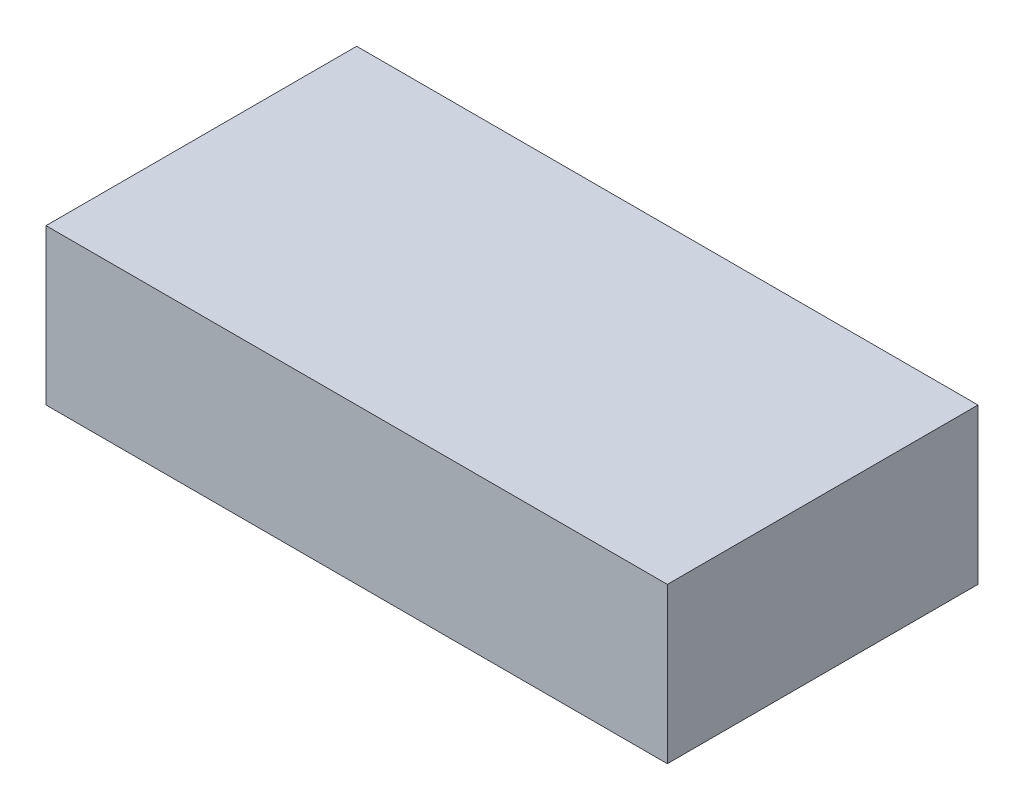
ISO-10303-21;
HEADER;
FILE_DESCRIPTION(('STEP AP214'),'2;1');
FILE_NAME('part.step','',(''),(''),'','','');
FILE_SCHEMA(('AUTOMOTIVE_DESIGN { 1 0 10303 214 1 1 1 1 }'));
ENDSEC;
DATA;
#1=APPLICATION_CONTEXT('core data for automotive mechanical design processes');
#2=APPLICATION_PROTOCOL_DEFINITION('international standard','automotive_design',2000,#1);
#3=PRODUCT_CONTEXT('',#1,'mechanical');
#4=PRODUCT('Part','Part','',(#3));
#5=PRODUCT_RELATED_PRODUCT_CATEGORY('part','',(#4));
#6=PRODUCT_DEFINITION_FORMATION('','',#4);
#7=PRODUCT_DEFINITION_CONTEXT('part definition',#1,'design');
#8=PRODUCT_DEFINITION('design','',#6,#7);
#9=PRODUCT_DEFINITION_SHAPE('','',#8);
#10=(LENGTH_UNIT() NAMED_UNIT(*) SI_UNIT(.MILLI.,.METRE.));
#11=(NAMED_UNIT(*) PLANE_ANGLE_UNIT() SI_UNIT($,.RADIAN.));
#12=(NAMED_UNIT(*) SI_UNIT($,.STERADIAN.) SOLID_ANGLE_UNIT());
#13=UNCERTAINTY_MEASURE_WITH_UNIT(LENGTH_MEASURE(1.E-05),#10,'distance_accuracy_value','');
#14=(GEOMETRIC_REPRESENTATION_CONTEXT(3) GLOBAL_UNCERTAINTY_ASSIGNED_CONTEXT((#13)) GLOBAL_UNIT_ASSIGNED_CONTEXT((#10,
#11,#12)) REPRESENTATION_CONTEXT('',''));
#15=CARTESIAN_POINT('',(0.,0.,0.));
#16=DIRECTION('',(0.,0.,1.));
#17=DIRECTION('',(1.,0.,0.));
#18=AXIS2_PLACEMENT_3D('',#15,#16,#17);
#19=CARTESIAN_POINT('',(0.,-10.,0.));
#20=DIRECTION('',(-1.,0.,0.));
#21=DIRECTION('',(0.,0.,1.));
#22=AXIS2_PLACEMENT_3D('',#19,#20,#21);
#23=PLANE('',#22);
#24=DIRECTION('',(0.,0.,1.));
#25=VECTOR('',#24,1.);
#26=CARTESIAN_POINT('',(0.,0.,0.));
#27=LINE('',#26,#25);
#28=CARTESIAN_POINT('',(0.,0.,-20.));
#29=VERTEX_POINT('',#28);
#30=CARTESIAN_POINT('',(0.,0.,0.));
#31=VERTEX_POINT('',#30);
#32=EDGE_CURVE('E104',#29,#31,#27,.T.);
#33=ORIENTED_EDGE('',*,*,#32,.F.);
#34=DIRECTION('',(0.,1.,0.));
#35=VECTOR('',#34,1.);
#36=CARTESIAN_POINT('',(0.,-10.,-20.));
#37=LINE('',#36,#35);
#38=CARTESIAN_POINT('',(0.,-10.,-20.));
#39=VERTEX_POINT('',#38);
#40=EDGE_CURVE('E11',#39,#29,#37,.T.);
#41=ORIENTED_EDGE('',*,*,#40,.F.);
#42=DIRECTION('',(0.,0.,1.));
#43=VECTOR('',#42,1.);
#44=CARTESIAN_POINT('',(0.,-10.,0.));
#45=LINE('',#44,#43);
#46=CARTESIAN_POINT('',(0.,-10.,0.));
#47=VERTEX_POINT('',#46);
#48=EDGE_CURVE('E100',#39,#47,#45,.T.);
#49=ORIENTED_EDGE('',*,*,#48,.T.);
#50=DIRECTION('',(0.,1.,0.));
#51=VECTOR('',#50,1.);
#52=CARTESIAN_POINT('',(0.,-10.,0.));
#53=LINE('',#52,#51);
#54=EDGE_CURVE('E45',#47,#31,#53,.T.);
#55=ORIENTED_EDGE('',*,*,#54,.T.);
#56=EDGE_LOOP('',(#33,#41,#49,#55));
#57=FACE_BOUND('',#56,.T.);
#58=ADVANCED_FACE('F39',(#57),#23,.T.);
#59=CARTESIAN_POINT('',(0.,-10.,-20.));
#60=DIRECTION('',(0.,0.,-1.));
#61=DIRECTION('',(-1.,0.,0.));
#62=AXIS2_PLACEMENT_3D('',#59,#60,#61);
#63=PLANE('',#62);
#64=DIRECTION('',(-1.,0.,0.));
#65=VECTOR('',#64,1.);
#66=CARTESIAN_POINT('',(0.,0.,-20.));
#67=LINE('',#66,#65);
#68=CARTESIAN_POINT('',(40.,0.,-20.));
#69=VERTEX_POINT('',#68);
#70=EDGE_CURVE('E98',#69,#29,#67,.T.);
#71=ORIENTED_EDGE('',*,*,#70,.F.);
#72=DIRECTION('',(0.,1.,0.));
#73=VECTOR('',#72,1.);
#74=CARTESIAN_POINT('',(40.,-10.,-20.));
#75=LINE('',#74,#73);
#76=CARTESIAN_POINT('',(40.,-10.,-20.));
#77=VERTEX_POINT('',#76);
#78=EDGE_CURVE('E48',#77,#69,#75,.T.);
#79=ORIENTED_EDGE('',*,*,#78,.F.);
#80=DIRECTION('',(-1.,0.,0.));
#81=VECTOR('',#80,1.);
#82=CARTESIAN_POINT('',(0.,-10.,-20.));
#83=LINE('',#82,#81);
#84=EDGE_CURVE('E92',#77,#39,#83,.T.);
#85=ORIENTED_EDGE('',*,*,#84,.T.);
#86=ORIENTED_EDGE('',*,*,#40,.T.);
#87=EDGE_LOOP('',(#71,#79,#85,#86));
#88=FACE_BOUND('',#87,.T.);
#89=ADVANCED_FACE('F111',(#88),#63,.T.);
#90=CARTESIAN_POINT('',(40.,-10.,0.));
#91=DIRECTION('',(1.,0.,0.));
#92=DIRECTION('',(0.,0.,-1.));
#93=AXIS2_PLACEMENT_3D('',#90,#91,#92);
#94=PLANE('',#93);
#95=DIRECTION('',(0.,0.,-1.));
#96=VECTOR('',#95,1.);
#97=CARTESIAN_POINT('',(40.,0.,0.));
#98=LINE('',#97,#96);
#99=CARTESIAN_POINT('',(40.,0.,0.));
#100=VERTEX_POINT('',#99);
#101=EDGE_CURVE('E87',#100,#69,#98,.T.);
#102=ORIENTED_EDGE('',*,*,#101,.F.);
#103=DIRECTION('',(0.,1.,0.));
#104=VECTOR('',#103,1.);
#105=CARTESIAN_POINT('',(40.,-10.,0.));
#106=LINE('',#105,#104);
#107=CARTESIAN_POINT('',(40.,-10.,0.));
#108=VERTEX_POINT('',#107);
#109=EDGE_CURVE('E84',#108,#100,#106,.T.);
#110=ORIENTED_EDGE('',*,*,#109,.F.);
#111=DIRECTION('',(0.,0.,-1.));
#112=VECTOR('',#111,1.);
#113=CARTESIAN_POINT('',(40.,-10.,0.));
#114=LINE('',#113,#112);
#115=EDGE_CURVE('E90',#108,#77,#114,.T.);
#116=ORIENTED_EDGE('',*,*,#115,.T.);
#117=ORIENTED_EDGE('',*,*,#78,.T.);
#118=EDGE_LOOP('',(#102,#110,#116,#117));
#119=FACE_BOUND('',#118,.T.);
#120=ADVANCED_FACE('F86',(#119),#94,.T.);
#121=CARTESIAN_POINT('',(0.,-10.,0.));
#122=DIRECTION('',(0.,0.,1.));
#123=DIRECTION('',(1.,0.,0.));
#124=AXIS2_PLACEMENT_3D('',#121,#122,#123);
#125=PLANE('',#124);
#126=DIRECTION('',(1.,0.,0.));
#127=VECTOR('',#126,1.);
#128=CARTESIAN_POINT('',(0.,0.,0.));
#129=LINE('',#128,#127);
#130=EDGE_CURVE('E106',#31,#100,#129,.T.);
#131=ORIENTED_EDGE('',*,*,#130,.F.);
#132=ORIENTED_EDGE('',*,*,#54,.F.);
#133=DIRECTION('',(1.,0.,0.));
#134=VECTOR('',#133,1.);
#135=CARTESIAN_POINT('',(0.,-10.,0.));
#136=LINE('',#135,#134);
#137=EDGE_CURVE('E93',#47,#108,#136,.T.);
#138=ORIENTED_EDGE('',*,*,#137,.T.);
#139=ORIENTED_EDGE('',*,*,#109,.T.);
#140=EDGE_LOOP('',(#131,#132,#138,#139));
#141=FACE_BOUND('',#140,.T.);
#142=ADVANCED_FACE('F96',(#141),#125,.T.);
#143=CARTESIAN_POINT('',(0.,-10.,0.));
#144=DIRECTION('',(0.,-1.,0.));
#145=DIRECTION('',(0.,0.,-1.));
#146=AXIS2_PLACEMENT_3D('',#143,#144,#145);
#147=PLANE('',#146);
#148=ORIENTED_EDGE('',*,*,#48,.F.);
#149=ORIENTED_EDGE('',*,*,#84,.F.);
#150=ORIENTED_EDGE('',*,*,#115,.F.);
#151=ORIENTED_EDGE('',*,*,#137,.F.);
#152=EDGE_LOOP('',(#148,#149,#150,#151));
#153=FACE_BOUND('',#152,.T.);
#154=ADVANCED_FACE('F95',(#153),#147,.T.);
#155=CARTESIAN_POINT('',(0.,0.,0.));
#156=DIRECTION('',(0.,-1.,0.));
#157=DIRECTION('',(0.,0.,-1.));
#158=AXIS2_PLACEMENT_3D('',#155,#156,#157);
#159=PLANE('',#158);
#160=ORIENTED_EDGE('',*,*,#32,.T.);
#161=ORIENTED_EDGE('',*,*,#130,.T.);
#162=ORIENTED_EDGE('',*,*,#101,.T.);
#163=ORIENTED_EDGE('',*,*,#70,.T.);
#164=EDGE_LOOP('',(#160,#161,#162,#163));
#165=FACE_BOUND('',#164,.T.);
#166=ADVANCED_FACE('F115',(#165),#159,.F.);
#167=CLOSED_SHELL('',(#58,#89,#120,#142,#154,#166));
#168=MANIFOLD_SOLID_BREP('B2',#167);
#169=ADVANCED_BREP_SHAPE_REPRESENTATION('',(#18,#168),#14);
#170=SHAPE_DEFINITION_REPRESENTATION(#9,#169);
ENDSEC;
END-ISO-10303-21;
